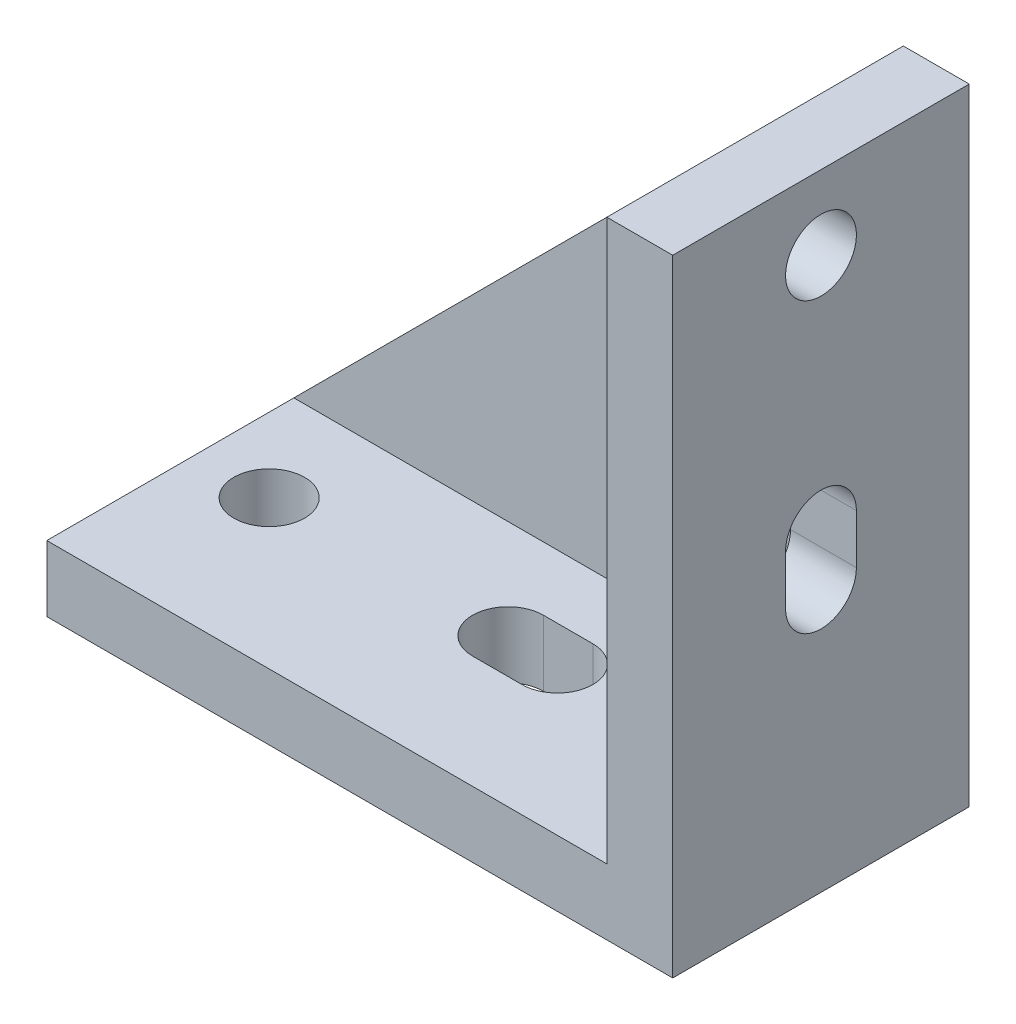
ISO-10303-21;
HEADER;
FILE_DESCRIPTION(('STEP AP214'),'2;1');
FILE_NAME('part.step','',(''),(''),'','','');
FILE_SCHEMA(('AUTOMOTIVE_DESIGN { 1 0 10303 214 1 1 1 1 }'));
ENDSEC;
DATA;
#1=APPLICATION_CONTEXT('core data for automotive mechanical design processes');
#2=APPLICATION_PROTOCOL_DEFINITION('international standard','automotive_design',2000,#1);
#3=PRODUCT_CONTEXT('',#1,'mechanical');
#4=PRODUCT('Part','Part','',(#3));
#5=PRODUCT_RELATED_PRODUCT_CATEGORY('part','',(#4));
#6=PRODUCT_DEFINITION_FORMATION('','',#4);
#7=PRODUCT_DEFINITION_CONTEXT('part definition',#1,'design');
#8=PRODUCT_DEFINITION('design','',#6,#7);
#9=PRODUCT_DEFINITION_SHAPE('','',#8);
#10=(LENGTH_UNIT() NAMED_UNIT(*) SI_UNIT(.MILLI.,.METRE.));
#11=(NAMED_UNIT(*) PLANE_ANGLE_UNIT() SI_UNIT($,.RADIAN.));
#12=(NAMED_UNIT(*) SI_UNIT($,.STERADIAN.) SOLID_ANGLE_UNIT());
#13=UNCERTAINTY_MEASURE_WITH_UNIT(LENGTH_MEASURE(1.E-05),#10,'distance_accuracy_value','');
#14=(GEOMETRIC_REPRESENTATION_CONTEXT(3) GLOBAL_UNCERTAINTY_ASSIGNED_CONTEXT((#13)) GLOBAL_UNIT_ASSIGNED_CONTEXT((#10,
#11,#12)) REPRESENTATION_CONTEXT('',''));
#15=CARTESIAN_POINT('',(0.,0.,0.));
#16=DIRECTION('',(0.,0.,1.));
#17=DIRECTION('',(1.,0.,0.));
#18=AXIS2_PLACEMENT_3D('',#15,#16,#17);
#19=CARTESIAN_POINT('',(0.,0.,9.));
#20=DIRECTION('',(-1.,0.,0.));
#21=DIRECTION('',(0.,0.,1.));
#22=AXIS2_PLACEMENT_3D('',#19,#20,#21);
#23=PLANE('',#22);
#24=CARTESIAN_POINT('',(0.,16.,0.));
#25=DIRECTION('',(1.,0.,0.));
#26=DIRECTION('',(0.,0.,1.));
#27=AXIS2_PLACEMENT_3D('',#24,#25,#26);
#28=CIRCLE('',#27,2.15);
#29=CARTESIAN_POINT('',(0.,16.,2.15));
#30=VERTEX_POINT('',#29);
#31=CARTESIAN_POINT('',(0.,16.,-2.15));
#32=VERTEX_POINT('',#31);
#33=EDGE_CURVE('E150',#30,#32,#28,.T.);
#34=ORIENTED_EDGE('',*,*,#33,.F.);
#35=DIRECTION('',(0.,-1.,0.));
#36=VECTOR('',#35,1.);
#37=CARTESIAN_POINT('',(0.,16.,2.15));
#38=LINE('',#37,#36);
#39=CARTESIAN_POINT('',(0.,19.,2.15));
#40=VERTEX_POINT('',#39);
#41=EDGE_CURVE('E142',#40,#30,#38,.T.);
#42=ORIENTED_EDGE('',*,*,#41,.F.);
#43=CARTESIAN_POINT('',(0.,19.,0.));
#44=DIRECTION('',(1.,0.,0.));
#45=DIRECTION('',(0.,0.,1.));
#46=AXIS2_PLACEMENT_3D('',#43,#44,#45);
#47=CIRCLE('',#46,2.15);
#48=CARTESIAN_POINT('',(0.,19.,-2.15));
#49=VERTEX_POINT('',#48);
#50=EDGE_CURVE('E149',#49,#40,#47,.T.);
#51=ORIENTED_EDGE('',*,*,#50,.F.);
#52=DIRECTION('',(0.,1.,0.));
#53=VECTOR('',#52,1.);
#54=CARTESIAN_POINT('',(0.,16.,-2.15));
#55=LINE('',#54,#53);
#56=EDGE_CURVE('E154',#32,#49,#55,.T.);
#57=ORIENTED_EDGE('',*,*,#56,.F.);
#58=EDGE_LOOP('',(#34,#42,#51,#57));
#59=FACE_BOUND('',#58,.T.);
#60=DIRECTION('',(0.,1.,0.));
#61=VECTOR('',#60,1.);
#62=CARTESIAN_POINT('',(0.,0.,-9.));
#63=LINE('',#62,#61);
#64=CARTESIAN_POINT('',(0.,0.,-9.));
#65=VERTEX_POINT('',#64);
#66=CARTESIAN_POINT('',(0.,38.,-9.));
#67=VERTEX_POINT('',#66);
#68=EDGE_CURVE('E253',#65,#67,#63,.T.);
#69=ORIENTED_EDGE('',*,*,#68,.T.);
#70=DIRECTION('',(0.,0.,-1.));
#71=VECTOR('',#70,1.);
#72=CARTESIAN_POINT('',(0.,38.,9.));
#73=LINE('',#72,#71);
#74=CARTESIAN_POINT('',(0.,38.,9.));
#75=VERTEX_POINT('',#74);
#76=EDGE_CURVE('E264',#75,#67,#73,.T.);
#77=ORIENTED_EDGE('',*,*,#76,.F.);
#78=DIRECTION('',(0.,1.,0.));
#79=VECTOR('',#78,1.);
#80=CARTESIAN_POINT('',(0.,0.,9.));
#81=LINE('',#80,#79);
#82=CARTESIAN_POINT('',(0.,0.,9.));
#83=VERTEX_POINT('',#82);
#84=EDGE_CURVE('E240',#83,#75,#81,.T.);
#85=ORIENTED_EDGE('',*,*,#84,.F.);
#86=DIRECTION('',(0.,0.,-1.));
#87=VECTOR('',#86,1.);
#88=CARTESIAN_POINT('',(0.,0.,9.));
#89=LINE('',#88,#87);
#90=EDGE_CURVE('E43',#83,#65,#89,.T.);
#91=ORIENTED_EDGE('',*,*,#90,.T.);
#92=EDGE_LOOP('',(#69,#77,#85,#91));
#93=FACE_BOUND('',#92,.T.);
#94=CARTESIAN_POINT('',(0.,33.5,0.));
#95=DIRECTION('',(1.,0.,0.));
#96=DIRECTION('',(0.,0.,1.));
#97=AXIS2_PLACEMENT_3D('',#94,#95,#96);
#98=CIRCLE('',#97,2.15);
#99=CARTESIAN_POINT('',(0.,33.5,2.15));
#100=VERTEX_POINT('',#99);
#101=EDGE_CURVE('E171',#100,#100,#98,.T.);
#102=ORIENTED_EDGE('',*,*,#101,.F.);
#103=EDGE_LOOP('',(#102));
#104=FACE_BOUND('',#103,.T.);
#105=ADVANCED_FACE('F35',(#59,#93,#104),#23,.F.);
#106=CARTESIAN_POINT('',(-4.,4.,9.));
#107=DIRECTION('',(1.,0.,0.));
#108=DIRECTION('',(0.,0.,-1.));
#109=AXIS2_PLACEMENT_3D('',#106,#107,#108);
#110=PLANE('',#109);
#111=CARTESIAN_POINT('',(-3.99999999999999,16.,0.));
#112=DIRECTION('',(1.,0.,0.));
#113=DIRECTION('',(0.,0.,1.));
#114=AXIS2_PLACEMENT_3D('',#111,#112,#113);
#115=CIRCLE('',#114,2.15);
#116=CARTESIAN_POINT('',(-4.,16.,2.15));
#117=VERTEX_POINT('',#116);
#118=CARTESIAN_POINT('',(-3.99999999999999,16.,-2.15));
#119=VERTEX_POINT('',#118);
#120=EDGE_CURVE('E58',#117,#119,#115,.T.);
#121=ORIENTED_EDGE('',*,*,#120,.T.);
#122=DIRECTION('',(0.,1.,0.));
#123=VECTOR('',#122,1.);
#124=CARTESIAN_POINT('',(-3.99999999999999,16.,-2.15));
#125=LINE('',#124,#123);
#126=CARTESIAN_POINT('',(-3.99999999999999,19.,-2.15));
#127=VERTEX_POINT('',#126);
#128=EDGE_CURVE('E158',#119,#127,#125,.T.);
#129=ORIENTED_EDGE('',*,*,#128,.T.);
#130=CARTESIAN_POINT('',(-3.99999999999999,19.,0.));
#131=DIRECTION('',(1.,0.,0.));
#132=DIRECTION('',(0.,0.,1.));
#133=AXIS2_PLACEMENT_3D('',#130,#131,#132);
#134=CIRCLE('',#133,2.15);
#135=CARTESIAN_POINT('',(-3.99999999999999,19.,2.15));
#136=VERTEX_POINT('',#135);
#137=EDGE_CURVE('E161',#127,#136,#134,.T.);
#138=ORIENTED_EDGE('',*,*,#137,.T.);
#139=DIRECTION('',(0.,-1.,0.));
#140=VECTOR('',#139,1.);
#141=CARTESIAN_POINT('',(-3.99999999999999,16.,2.15));
#142=LINE('',#141,#140);
#143=EDGE_CURVE('E170',#136,#117,#142,.T.);
#144=ORIENTED_EDGE('',*,*,#143,.T.);
#145=EDGE_LOOP('',(#121,#129,#138,#144));
#146=FACE_BOUND('',#145,.T.);
#147=DIRECTION('',(0.,0.,-1.));
#148=VECTOR('',#147,1.);
#149=CARTESIAN_POINT('',(-4.,38.,9.));
#150=LINE('',#149,#148);
#151=CARTESIAN_POINT('',(-4.,38.,9.));
#152=VERTEX_POINT('',#151);
#153=CARTESIAN_POINT('',(-4.,38.,-6.));
#154=VERTEX_POINT('',#153);
#155=EDGE_CURVE('E261',#152,#154,#150,.T.);
#156=ORIENTED_EDGE('',*,*,#155,.T.);
#157=DIRECTION('',(0.,-1.,0.));
#158=VECTOR('',#157,1.);
#159=CARTESIAN_POINT('',(-4.,38.,-6.));
#160=LINE('',#159,#158);
#161=CARTESIAN_POINT('',(-4.,4.,-6.));
#162=VERTEX_POINT('',#161);
#163=EDGE_CURVE('E224',#154,#162,#160,.T.);
#164=ORIENTED_EDGE('',*,*,#163,.T.);
#165=DIRECTION('',(0.,0.,-1.));
#166=VECTOR('',#165,1.);
#167=CARTESIAN_POINT('',(-4.,4.,9.));
#168=LINE('',#167,#166);
#169=CARTESIAN_POINT('',(-4.,4.,9.));
#170=VERTEX_POINT('',#169);
#171=EDGE_CURVE('E258',#170,#162,#168,.T.);
#172=ORIENTED_EDGE('',*,*,#171,.F.);
#173=DIRECTION('',(0.,-1.,0.));
#174=VECTOR('',#173,1.);
#175=CARTESIAN_POINT('',(-4.,4.,9.));
#176=LINE('',#175,#174);
#177=EDGE_CURVE('E244',#152,#170,#176,.T.);
#178=ORIENTED_EDGE('',*,*,#177,.F.);
#179=EDGE_LOOP('',(#156,#164,#172,#178));
#180=FACE_BOUND('',#179,.T.);
#181=CARTESIAN_POINT('',(-3.99999999999999,33.5,0.));
#182=DIRECTION('',(1.,0.,0.));
#183=DIRECTION('',(0.,0.,1.));
#184=AXIS2_PLACEMENT_3D('',#181,#182,#183);
#185=CIRCLE('',#184,2.15);
#186=CARTESIAN_POINT('',(-3.99999999999999,33.5,2.15));
#187=VERTEX_POINT('',#186);
#188=EDGE_CURVE('E164',#187,#187,#185,.T.);
#189=ORIENTED_EDGE('',*,*,#188,.T.);
#190=EDGE_LOOP('',(#189));
#191=FACE_BOUND('',#190,.T.);
#192=ADVANCED_FACE('F292',(#146,#180,#191),#110,.F.);
#193=CARTESIAN_POINT('',(-38.,4.,9.));
#194=DIRECTION('',(1.,0.,0.));
#195=DIRECTION('',(0.,0.,-1.));
#196=AXIS2_PLACEMENT_3D('',#193,#194,#195);
#197=PLANE('',#196);
#198=DIRECTION('',(0.,-1.,0.));
#199=VECTOR('',#198,1.);
#200=CARTESIAN_POINT('',(-38.,4.,-9.));
#201=LINE('',#200,#199);
#202=CARTESIAN_POINT('',(-38.,4.,-9.));
#203=VERTEX_POINT('',#202);
#204=CARTESIAN_POINT('',(-38.,0.,-9.));
#205=VERTEX_POINT('',#204);
#206=EDGE_CURVE('E232',#203,#205,#201,.T.);
#207=ORIENTED_EDGE('',*,*,#206,.T.);
#208=DIRECTION('',(0.,0.,-1.));
#209=VECTOR('',#208,1.);
#210=CARTESIAN_POINT('',(-38.,0.,9.));
#211=LINE('',#210,#209);
#212=CARTESIAN_POINT('',(-38.,0.,9.));
#213=VERTEX_POINT('',#212);
#214=EDGE_CURVE('E11',#213,#205,#211,.T.);
#215=ORIENTED_EDGE('',*,*,#214,.F.);
#216=DIRECTION('',(0.,-1.,0.));
#217=VECTOR('',#216,1.);
#218=CARTESIAN_POINT('',(-38.,4.,9.));
#219=LINE('',#218,#217);
#220=CARTESIAN_POINT('',(-38.,4.,9.));
#221=VERTEX_POINT('',#220);
#222=EDGE_CURVE('E234',#221,#213,#219,.T.);
#223=ORIENTED_EDGE('',*,*,#222,.F.);
#224=DIRECTION('',(0.,0.,-1.));
#225=VECTOR('',#224,1.);
#226=CARTESIAN_POINT('',(-38.,4.,9.));
#227=LINE('',#226,#225);
#228=CARTESIAN_POINT('',(-38.,4.,-6.));
#229=VERTEX_POINT('',#228);
#230=EDGE_CURVE('E248',#221,#229,#227,.T.);
#231=ORIENTED_EDGE('',*,*,#230,.T.);
#232=DIRECTION('',(0.,0.,-1.));
#233=VECTOR('',#232,1.);
#234=CARTESIAN_POINT('',(-38.,4.,-6.));
#235=LINE('',#234,#233);
#236=EDGE_CURVE('E226',#229,#203,#235,.T.);
#237=ORIENTED_EDGE('',*,*,#236,.T.);
#238=EDGE_LOOP('',(#207,#215,#223,#231,#237));
#239=FACE_BOUND('',#238,.T.);
#240=ADVANCED_FACE('F37',(#239),#197,.F.);
#241=CARTESIAN_POINT('',(-38.,0.,9.));
#242=DIRECTION('',(0.,1.,0.));
#243=DIRECTION('',(0.,0.,1.));
#244=AXIS2_PLACEMENT_3D('',#241,#242,#243);
#245=PLANE('',#244);
#246=CARTESIAN_POINT('',(-33.5,0.,0.));
#247=DIRECTION('',(0.,1.,0.));
#248=DIRECTION('',(0.,0.,1.));
#249=AXIS2_PLACEMENT_3D('',#246,#247,#248);
#250=CIRCLE('',#249,2.15);
#251=CARTESIAN_POINT('',(-33.5,0.,2.15));
#252=VERTEX_POINT('',#251);
#253=EDGE_CURVE('E181',#252,#252,#250,.T.);
#254=ORIENTED_EDGE('',*,*,#253,.T.);
#255=EDGE_LOOP('',(#254));
#256=FACE_BOUND('',#255,.T.);
#257=DIRECTION('',(1.,0.,0.));
#258=VECTOR('',#257,1.);
#259=CARTESIAN_POINT('',(-16.,0.,2.15));
#260=LINE('',#259,#258);
#261=CARTESIAN_POINT('',(-19.,0.,2.15));
#262=VERTEX_POINT('',#261);
#263=CARTESIAN_POINT('',(-16.,0.,2.15));
#264=VERTEX_POINT('',#263);
#265=EDGE_CURVE('E197',#262,#264,#260,.T.);
#266=ORIENTED_EDGE('',*,*,#265,.T.);
#267=CARTESIAN_POINT('',(-16.,0.,0.));
#268=DIRECTION('',(0.,1.,0.));
#269=DIRECTION('',(0.,0.,1.));
#270=AXIS2_PLACEMENT_3D('',#267,#268,#269);
#271=CIRCLE('',#270,2.15);
#272=CARTESIAN_POINT('',(-16.,0.,-2.15));
#273=VERTEX_POINT('',#272);
#274=EDGE_CURVE('E187',#264,#273,#271,.T.);
#275=ORIENTED_EDGE('',*,*,#274,.T.);
#276=DIRECTION('',(-1.,0.,0.));
#277=VECTOR('',#276,1.);
#278=CARTESIAN_POINT('',(-16.,0.,-2.15));
#279=LINE('',#278,#277);
#280=CARTESIAN_POINT('',(-19.,0.,-2.15));
#281=VERTEX_POINT('',#280);
#282=EDGE_CURVE('E190',#273,#281,#279,.T.);
#283=ORIENTED_EDGE('',*,*,#282,.T.);
#284=CARTESIAN_POINT('',(-19.,0.,0.));
#285=DIRECTION('',(0.,1.,0.));
#286=DIRECTION('',(0.,0.,1.));
#287=AXIS2_PLACEMENT_3D('',#284,#285,#286);
#288=CIRCLE('',#287,2.15);
#289=EDGE_CURVE('E194',#281,#262,#288,.T.);
#290=ORIENTED_EDGE('',*,*,#289,.T.);
#291=EDGE_LOOP('',(#266,#275,#283,#290));
#292=FACE_BOUND('',#291,.T.);
#293=DIRECTION('',(1.,0.,0.));
#294=VECTOR('',#293,1.);
#295=CARTESIAN_POINT('',(-38.,0.,-9.));
#296=LINE('',#295,#294);
#297=EDGE_CURVE('E251',#205,#65,#296,.T.);
#298=ORIENTED_EDGE('',*,*,#297,.T.);
#299=ORIENTED_EDGE('',*,*,#90,.F.);
#300=DIRECTION('',(1.,0.,0.));
#301=VECTOR('',#300,1.);
#302=CARTESIAN_POINT('',(-38.,0.,9.));
#303=LINE('',#302,#301);
#304=EDGE_CURVE('E237',#213,#83,#303,.T.);
#305=ORIENTED_EDGE('',*,*,#304,.F.);
#306=ORIENTED_EDGE('',*,*,#214,.T.);
#307=EDGE_LOOP('',(#298,#299,#305,#306));
#308=FACE_BOUND('',#307,.T.);
#309=ADVANCED_FACE('F303',(#256,#292,#308),#245,.F.);
#310=CARTESIAN_POINT('',(-4.,38.,9.));
#311=DIRECTION('',(0.,-1.,0.));
#312=DIRECTION('',(0.,0.,-1.));
#313=AXIS2_PLACEMENT_3D('',#310,#311,#312);
#314=PLANE('',#313);
#315=DIRECTION('',(-1.,0.,0.));
#316=VECTOR('',#315,1.);
#317=CARTESIAN_POINT('',(-4.,38.,-9.));
#318=LINE('',#317,#316);
#319=CARTESIAN_POINT('',(-4.,38.,-9.));
#320=VERTEX_POINT('',#319);
#321=EDGE_CURVE('E238',#67,#320,#318,.T.);
#322=ORIENTED_EDGE('',*,*,#321,.T.);
#323=DIRECTION('',(0.,0.,-1.));
#324=VECTOR('',#323,1.);
#325=CARTESIAN_POINT('',(-4.,38.,-6.));
#326=LINE('',#325,#324);
#327=EDGE_CURVE('E229',#154,#320,#326,.T.);
#328=ORIENTED_EDGE('',*,*,#327,.F.);
#329=ORIENTED_EDGE('',*,*,#155,.F.);
#330=DIRECTION('',(-1.,0.,0.));
#331=VECTOR('',#330,1.);
#332=CARTESIAN_POINT('',(-4.,38.,9.));
#333=LINE('',#332,#331);
#334=EDGE_CURVE('E242',#75,#152,#333,.T.);
#335=ORIENTED_EDGE('',*,*,#334,.F.);
#336=ORIENTED_EDGE('',*,*,#76,.T.);
#337=EDGE_LOOP('',(#322,#328,#329,#335,#336));
#338=FACE_BOUND('',#337,.T.);
#339=ADVANCED_FACE('F279',(#338),#314,.F.);
#340=CARTESIAN_POINT('',(-38.,4.,9.));
#341=DIRECTION('',(0.,-1.,0.));
#342=DIRECTION('',(0.,0.,-1.));
#343=AXIS2_PLACEMENT_3D('',#340,#341,#342);
#344=PLANE('',#343);
#345=CARTESIAN_POINT('',(-33.5,4.,0.));
#346=DIRECTION('',(0.,1.,0.));
#347=DIRECTION('',(0.,0.,1.));
#348=AXIS2_PLACEMENT_3D('',#345,#346,#347);
#349=CIRCLE('',#348,2.15);
#350=CARTESIAN_POINT('',(-33.5,4.,2.15));
#351=VERTEX_POINT('',#350);
#352=EDGE_CURVE('E177',#351,#351,#349,.T.);
#353=ORIENTED_EDGE('',*,*,#352,.F.);
#354=EDGE_LOOP('',(#353));
#355=FACE_BOUND('',#354,.T.);
#356=DIRECTION('',(-1.,0.,0.));
#357=VECTOR('',#356,1.);
#358=CARTESIAN_POINT('',(-16.,4.,-2.15));
#359=LINE('',#358,#357);
#360=CARTESIAN_POINT('',(-16.,4.,-2.15));
#361=VERTEX_POINT('',#360);
#362=CARTESIAN_POINT('',(-19.,4.,-2.15));
#363=VERTEX_POINT('',#362);
#364=EDGE_CURVE('E202',#361,#363,#359,.T.);
#365=ORIENTED_EDGE('',*,*,#364,.F.);
#366=CARTESIAN_POINT('',(-16.,4.,0.));
#367=DIRECTION('',(0.,1.,0.));
#368=DIRECTION('',(0.,0.,1.));
#369=AXIS2_PLACEMENT_3D('',#366,#367,#368);
#370=CIRCLE('',#369,2.15);
#371=CARTESIAN_POINT('',(-16.,4.,2.15));
#372=VERTEX_POINT('',#371);
#373=EDGE_CURVE('E184',#372,#361,#370,.T.);
#374=ORIENTED_EDGE('',*,*,#373,.F.);
#375=DIRECTION('',(1.,0.,0.));
#376=VECTOR('',#375,1.);
#377=CARTESIAN_POINT('',(-16.,4.,2.15));
#378=LINE('',#377,#376);
#379=CARTESIAN_POINT('',(-19.,4.,2.15));
#380=VERTEX_POINT('',#379);
#381=EDGE_CURVE('E191',#380,#372,#378,.T.);
#382=ORIENTED_EDGE('',*,*,#381,.F.);
#383=CARTESIAN_POINT('',(-19.,4.,0.));
#384=DIRECTION('',(0.,1.,0.));
#385=DIRECTION('',(0.,0.,1.));
#386=AXIS2_PLACEMENT_3D('',#383,#384,#385);
#387=CIRCLE('',#386,2.15);
#388=EDGE_CURVE('E205',#363,#380,#387,.T.);
#389=ORIENTED_EDGE('',*,*,#388,.F.);
#390=EDGE_LOOP('',(#365,#374,#382,#389));
#391=FACE_BOUND('',#390,.T.);
#392=ORIENTED_EDGE('',*,*,#171,.T.);
#393=DIRECTION('',(-1.,0.,0.));
#394=VECTOR('',#393,1.);
#395=CARTESIAN_POINT('',(-4.,4.,-6.));
#396=LINE('',#395,#394);
#397=EDGE_CURVE('E219',#162,#229,#396,.T.);
#398=ORIENTED_EDGE('',*,*,#397,.T.);
#399=ORIENTED_EDGE('',*,*,#230,.F.);
#400=DIRECTION('',(-1.,0.,0.));
#401=VECTOR('',#400,1.);
#402=CARTESIAN_POINT('',(-38.,4.,9.));
#403=LINE('',#402,#401);
#404=EDGE_CURVE('E246',#170,#221,#403,.T.);
#405=ORIENTED_EDGE('',*,*,#404,.F.);
#406=EDGE_LOOP('',(#392,#398,#399,#405));
#407=FACE_BOUND('',#406,.T.);
#408=ADVANCED_FACE('F297',(#355,#391,#407),#344,.F.);
#409=CARTESIAN_POINT('',(0.,0.,9.));
#410=DIRECTION('',(0.,0.,1.));
#411=DIRECTION('',(1.,0.,0.));
#412=AXIS2_PLACEMENT_3D('',#409,#410,#411);
#413=PLANE('',#412);
#414=ORIENTED_EDGE('',*,*,#222,.T.);
#415=ORIENTED_EDGE('',*,*,#304,.T.);
#416=ORIENTED_EDGE('',*,*,#84,.T.);
#417=ORIENTED_EDGE('',*,*,#334,.T.);
#418=ORIENTED_EDGE('',*,*,#177,.T.);
#419=ORIENTED_EDGE('',*,*,#404,.T.);
#420=EDGE_LOOP('',(#414,#415,#416,#417,#418,#419));
#421=FACE_BOUND('',#420,.T.);
#422=ADVANCED_FACE('F301',(#421),#413,.T.);
#423=CARTESIAN_POINT('',(0.,0.,-9.));
#424=DIRECTION('',(0.,0.,1.));
#425=DIRECTION('',(1.,0.,0.));
#426=AXIS2_PLACEMENT_3D('',#423,#424,#425);
#427=PLANE('',#426);
#428=ORIENTED_EDGE('',*,*,#206,.F.);
#429=DIRECTION('',(0.707106781186547,0.707106781186547,0.));
#430=VECTOR('',#429,1.);
#431=CARTESIAN_POINT('',(-38.,4.,-9.));
#432=LINE('',#431,#430);
#433=EDGE_CURVE('E212',#203,#320,#432,.T.);
#434=ORIENTED_EDGE('',*,*,#433,.T.);
#435=ORIENTED_EDGE('',*,*,#321,.F.);
#436=ORIENTED_EDGE('',*,*,#68,.F.);
#437=ORIENTED_EDGE('',*,*,#297,.F.);
#438=EDGE_LOOP('',(#428,#434,#435,#436,#437));
#439=FACE_BOUND('',#438,.T.);
#440=ADVANCED_FACE('F276',(#439),#427,.F.);
#441=CARTESIAN_POINT('',(-38.,4.,-6.));
#442=DIRECTION('',(-0.707106781186548,0.707106781186548,0.));
#443=DIRECTION('',(-0.707106781186548,-0.707106781186548,0.));
#444=AXIS2_PLACEMENT_3D('',#441,#442,#443);
#445=PLANE('',#444);
#446=ORIENTED_EDGE('',*,*,#433,.F.);
#447=ORIENTED_EDGE('',*,*,#236,.F.);
#448=DIRECTION('',(0.707106781186547,0.707106781186547,0.));
#449=VECTOR('',#448,1.);
#450=CARTESIAN_POINT('',(-38.,4.,-6.));
#451=LINE('',#450,#449);
#452=EDGE_CURVE('E221',#229,#154,#451,.T.);
#453=ORIENTED_EDGE('',*,*,#452,.T.);
#454=ORIENTED_EDGE('',*,*,#327,.T.);
#455=EDGE_LOOP('',(#446,#447,#453,#454));
#456=FACE_BOUND('',#455,.T.);
#457=ADVANCED_FACE('F283',(#456),#445,.T.);
#458=CARTESIAN_POINT('',(0.,0.,-6.));
#459=DIRECTION('',(0.,0.,1.));
#460=DIRECTION('',(1.,0.,0.));
#461=AXIS2_PLACEMENT_3D('',#458,#459,#460);
#462=PLANE('',#461);
#463=ORIENTED_EDGE('',*,*,#397,.F.);
#464=ORIENTED_EDGE('',*,*,#163,.F.);
#465=ORIENTED_EDGE('',*,*,#452,.F.);
#466=EDGE_LOOP('',(#463,#464,#465));
#467=FACE_BOUND('',#466,.T.);
#468=ADVANCED_FACE('F289',(#467),#462,.T.);
#469=CARTESIAN_POINT('',(-16.,0.,0.));
#470=DIRECTION('',(0.,1.,0.));
#471=DIRECTION('',(0.,0.,1.));
#472=AXIS2_PLACEMENT_3D('',#469,#470,#471);
#473=CYLINDRICAL_SURFACE('',#472,2.15);
#474=ORIENTED_EDGE('',*,*,#373,.T.);
#475=DIRECTION('',(0.,1.,0.));
#476=VECTOR('',#475,1.);
#477=CARTESIAN_POINT('',(-16.,0.,-2.15));
#478=LINE('',#477,#476);
#479=EDGE_CURVE('E200',#273,#361,#478,.T.);
#480=ORIENTED_EDGE('',*,*,#479,.F.);
#481=ORIENTED_EDGE('',*,*,#274,.F.);
#482=DIRECTION('',(0.,1.,0.));
#483=VECTOR('',#482,1.);
#484=CARTESIAN_POINT('',(-16.,0.,2.15));
#485=LINE('',#484,#483);
#486=EDGE_CURVE('E210',#264,#372,#485,.T.);
#487=ORIENTED_EDGE('',*,*,#486,.T.);
#488=EDGE_LOOP('',(#474,#480,#481,#487));
#489=FACE_BOUND('',#488,.T.);
#490=ADVANCED_FACE('F331',(#489),#473,.F.);
#491=CARTESIAN_POINT('',(-16.,0.,2.15));
#492=DIRECTION('',(0.,0.,1.));
#493=DIRECTION('',(1.,0.,0.));
#494=AXIS2_PLACEMENT_3D('',#491,#492,#493);
#495=PLANE('',#494);
#496=ORIENTED_EDGE('',*,*,#381,.T.);
#497=ORIENTED_EDGE('',*,*,#486,.F.);
#498=ORIENTED_EDGE('',*,*,#265,.F.);
#499=DIRECTION('',(0.,1.,0.));
#500=VECTOR('',#499,1.);
#501=CARTESIAN_POINT('',(-19.,0.,2.15));
#502=LINE('',#501,#500);
#503=EDGE_CURVE('E213',#262,#380,#502,.T.);
#504=ORIENTED_EDGE('',*,*,#503,.T.);
#505=EDGE_LOOP('',(#496,#497,#498,#504));
#506=FACE_BOUND('',#505,.T.);
#507=ADVANCED_FACE('F334',(#506),#495,.F.);
#508=CARTESIAN_POINT('',(-19.,0.,0.));
#509=DIRECTION('',(0.,1.,0.));
#510=DIRECTION('',(0.,0.,1.));
#511=AXIS2_PLACEMENT_3D('',#508,#509,#510);
#512=CYLINDRICAL_SURFACE('',#511,2.15);
#513=ORIENTED_EDGE('',*,*,#388,.T.);
#514=ORIENTED_EDGE('',*,*,#503,.F.);
#515=ORIENTED_EDGE('',*,*,#289,.F.);
#516=DIRECTION('',(0.,1.,0.));
#517=VECTOR('',#516,1.);
#518=CARTESIAN_POINT('',(-19.,0.,-2.15));
#519=LINE('',#518,#517);
#520=EDGE_CURVE('E215',#281,#363,#519,.T.);
#521=ORIENTED_EDGE('',*,*,#520,.T.);
#522=EDGE_LOOP('',(#513,#514,#515,#521));
#523=FACE_BOUND('',#522,.T.);
#524=ADVANCED_FACE('F340',(#523),#512,.F.);
#525=CARTESIAN_POINT('',(-16.,0.,-2.15));
#526=DIRECTION('',(0.,0.,-1.));
#527=DIRECTION('',(-1.,0.,0.));
#528=AXIS2_PLACEMENT_3D('',#525,#526,#527);
#529=PLANE('',#528);
#530=ORIENTED_EDGE('',*,*,#364,.T.);
#531=ORIENTED_EDGE('',*,*,#520,.F.);
#532=ORIENTED_EDGE('',*,*,#282,.F.);
#533=ORIENTED_EDGE('',*,*,#479,.T.);
#534=EDGE_LOOP('',(#530,#531,#532,#533));
#535=FACE_BOUND('',#534,.T.);
#536=ADVANCED_FACE('F336',(#535),#529,.F.);
#537=CARTESIAN_POINT('',(-33.5,0.,0.));
#538=DIRECTION('',(0.,1.,0.));
#539=DIRECTION('',(0.,0.,1.));
#540=AXIS2_PLACEMENT_3D('',#537,#538,#539);
#541=CYLINDRICAL_SURFACE('',#540,2.15);
#542=ORIENTED_EDGE('',*,*,#253,.F.);
#543=EDGE_LOOP('',(#542));
#544=FACE_BOUND('',#543,.T.);
#545=ORIENTED_EDGE('',*,*,#352,.T.);
#546=EDGE_LOOP('',(#545));
#547=FACE_BOUND('',#546,.T.);
#548=ADVANCED_FACE('F339',(#544,#547),#541,.F.);
#549=CARTESIAN_POINT('',(0.,16.,0.));
#550=DIRECTION('',(-1.,0.,0.));
#551=DIRECTION('',(0.,-1.,0.));
#552=AXIS2_PLACEMENT_3D('',#549,#550,#551);
#553=CYLINDRICAL_SURFACE('',#552,2.15);
#554=ORIENTED_EDGE('',*,*,#120,.F.);
#555=DIRECTION('',(-1.,0.,0.));
#556=VECTOR('',#555,1.);
#557=CARTESIAN_POINT('',(0.,16.,2.15));
#558=LINE('',#557,#556);
#559=EDGE_CURVE('E144',#30,#117,#558,.T.);
#560=ORIENTED_EDGE('',*,*,#559,.F.);
#561=ORIENTED_EDGE('',*,*,#33,.T.);
#562=DIRECTION('',(-1.,0.,0.));
#563=VECTOR('',#562,1.);
#564=CARTESIAN_POINT('',(0.,16.,-2.15));
#565=LINE('',#564,#563);
#566=EDGE_CURVE('E175',#32,#119,#565,.T.);
#567=ORIENTED_EDGE('',*,*,#566,.T.);
#568=EDGE_LOOP('',(#554,#560,#561,#567));
#569=FACE_BOUND('',#568,.T.);
#570=ADVANCED_FACE('F152',(#569),#553,.F.);
#571=CARTESIAN_POINT('',(0.,16.,-2.15));
#572=DIRECTION('',(0.,0.,1.));
#573=DIRECTION('',(0.,-1.,0.));
#574=AXIS2_PLACEMENT_3D('',#571,#572,#573);
#575=PLANE('',#574);
#576=ORIENTED_EDGE('',*,*,#128,.F.);
#577=ORIENTED_EDGE('',*,*,#566,.F.);
#578=ORIENTED_EDGE('',*,*,#56,.T.);
#579=DIRECTION('',(-1.,0.,0.));
#580=VECTOR('',#579,1.);
#581=CARTESIAN_POINT('',(0.,19.,-2.15));
#582=LINE('',#581,#580);
#583=EDGE_CURVE('E178',#49,#127,#582,.T.);
#584=ORIENTED_EDGE('',*,*,#583,.T.);
#585=EDGE_LOOP('',(#576,#577,#578,#584));
#586=FACE_BOUND('',#585,.T.);
#587=ADVANCED_FACE('F353',(#586),#575,.T.);
#588=CARTESIAN_POINT('',(0.,19.,0.));
#589=DIRECTION('',(-1.,0.,0.));
#590=DIRECTION('',(0.,-1.,0.));
#591=AXIS2_PLACEMENT_3D('',#588,#589,#590);
#592=CYLINDRICAL_SURFACE('',#591,2.15);
#593=ORIENTED_EDGE('',*,*,#137,.F.);
#594=ORIENTED_EDGE('',*,*,#583,.F.);
#595=ORIENTED_EDGE('',*,*,#50,.T.);
#596=DIRECTION('',(-1.,0.,0.));
#597=VECTOR('',#596,1.);
#598=CARTESIAN_POINT('',(0.,19.,2.15));
#599=LINE('',#598,#597);
#600=EDGE_CURVE('E50',#40,#136,#599,.T.);
#601=ORIENTED_EDGE('',*,*,#600,.T.);
#602=EDGE_LOOP('',(#593,#594,#595,#601));
#603=FACE_BOUND('',#602,.T.);
#604=ADVANCED_FACE('F357',(#603),#592,.F.);
#605=CARTESIAN_POINT('',(0.,16.,2.15));
#606=DIRECTION('',(0.,0.,-1.));
#607=DIRECTION('',(0.,1.,0.));
#608=AXIS2_PLACEMENT_3D('',#605,#606,#607);
#609=PLANE('',#608);
#610=ORIENTED_EDGE('',*,*,#143,.F.);
#611=ORIENTED_EDGE('',*,*,#600,.F.);
#612=ORIENTED_EDGE('',*,*,#41,.T.);
#613=ORIENTED_EDGE('',*,*,#559,.T.);
#614=EDGE_LOOP('',(#610,#611,#612,#613));
#615=FACE_BOUND('',#614,.T.);
#616=ADVANCED_FACE('F143',(#615),#609,.T.);
#617=CARTESIAN_POINT('',(0.,33.5,0.));
#618=DIRECTION('',(-1.,0.,0.));
#619=DIRECTION('',(0.,-1.,0.));
#620=AXIS2_PLACEMENT_3D('',#617,#618,#619);
#621=CYLINDRICAL_SURFACE('',#620,2.15);
#622=ORIENTED_EDGE('',*,*,#101,.T.);
#623=EDGE_LOOP('',(#622));
#624=FACE_BOUND('',#623,.T.);
#625=ORIENTED_EDGE('',*,*,#188,.F.);
#626=EDGE_LOOP('',(#625));
#627=FACE_BOUND('',#626,.T.);
#628=ADVANCED_FACE('F356',(#624,#627),#621,.F.);
#629=CLOSED_SHELL('',(#105,#192,#240,#309,#339,#408,#422,#440,#457,#468,#490,#507,#524,#536,
#548,#570,#587,#604,#616,#628));
#630=MANIFOLD_SOLID_BREP('B2',#629);
#631=ADVANCED_BREP_SHAPE_REPRESENTATION('',(#18,#630),#14);
#632=SHAPE_DEFINITION_REPRESENTATION(#9,#631);
ENDSEC;
END-ISO-10303-21;
